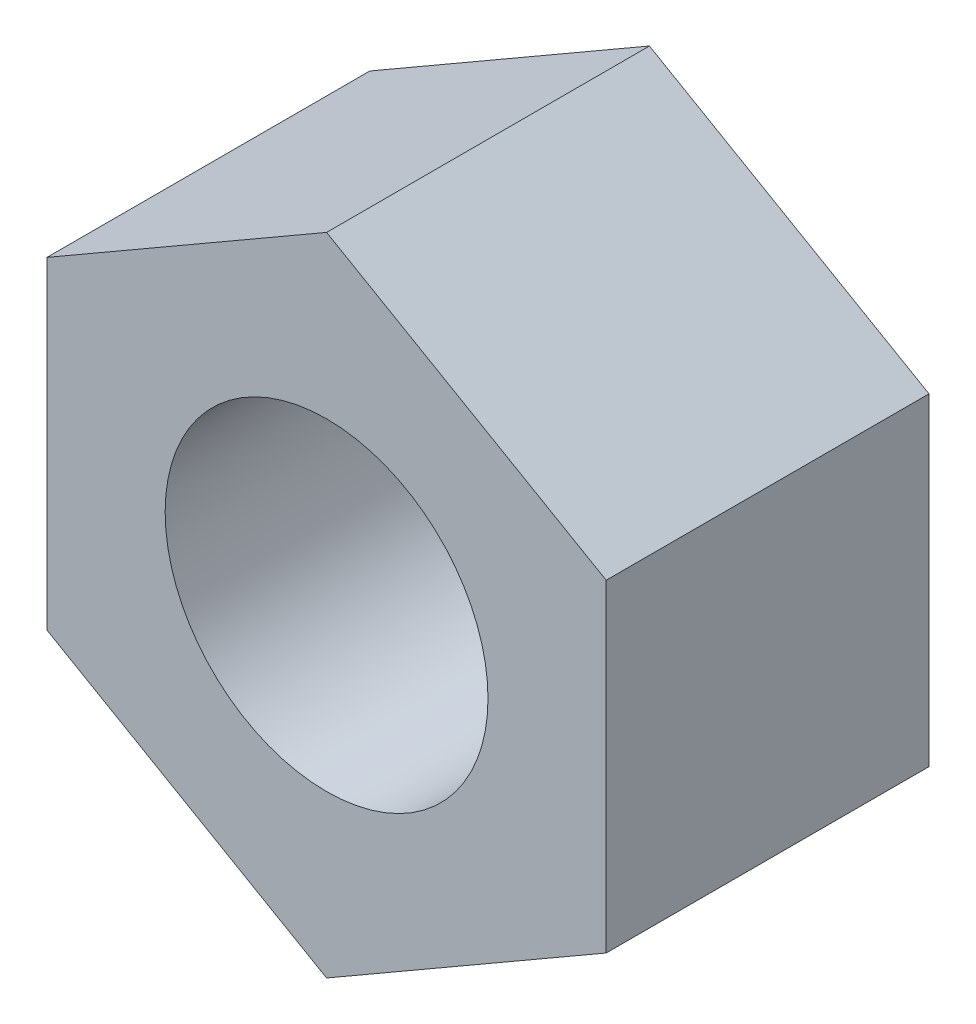
ISO-10303-21;
HEADER;
FILE_DESCRIPTION(('STEP AP214'),'2;1');
FILE_NAME('part.step','',(''),(''),'','','');
FILE_SCHEMA(('AUTOMOTIVE_DESIGN { 1 0 10303 214 1 1 1 1 }'));
ENDSEC;
DATA;
#1=APPLICATION_CONTEXT('core data for automotive mechanical design processes');
#2=APPLICATION_PROTOCOL_DEFINITION('international standard','automotive_design',2000,#1);
#3=PRODUCT_CONTEXT('',#1,'mechanical');
#4=PRODUCT('Part','Part','',(#3));
#5=PRODUCT_RELATED_PRODUCT_CATEGORY('part','',(#4));
#6=PRODUCT_DEFINITION_FORMATION('','',#4);
#7=PRODUCT_DEFINITION_CONTEXT('part definition',#1,'design');
#8=PRODUCT_DEFINITION('design','',#6,#7);
#9=PRODUCT_DEFINITION_SHAPE('','',#8);
#10=(LENGTH_UNIT() NAMED_UNIT(*) SI_UNIT(.MILLI.,.METRE.));
#11=(NAMED_UNIT(*) PLANE_ANGLE_UNIT() SI_UNIT($,.RADIAN.));
#12=(NAMED_UNIT(*) SI_UNIT($,.STERADIAN.) SOLID_ANGLE_UNIT());
#13=UNCERTAINTY_MEASURE_WITH_UNIT(LENGTH_MEASURE(1.E-05),#10,'distance_accuracy_value','');
#14=(GEOMETRIC_REPRESENTATION_CONTEXT(3) GLOBAL_UNCERTAINTY_ASSIGNED_CONTEXT((#13)) GLOBAL_UNIT_ASSIGNED_CONTEXT((#10,
#11,#12)) REPRESENTATION_CONTEXT('',''));
#15=CARTESIAN_POINT('',(0.,0.,0.));
#16=DIRECTION('',(0.,0.,1.));
#17=DIRECTION('',(1.,0.,0.));
#18=AXIS2_PLACEMENT_3D('',#15,#16,#17);
#19=CARTESIAN_POINT('',(1.73205080756888,1.,2.));
#20=DIRECTION('',(-0.5,-0.866025403784439,0.));
#21=DIRECTION('',(0.866025403784439,-0.5,0.));
#22=AXIS2_PLACEMENT_3D('',#19,#20,#21);
#23=PLANE('',#22);
#24=DIRECTION('',(-0.866025403784439,0.5,0.));
#25=VECTOR('',#24,1.);
#26=CARTESIAN_POINT('',(1.73205080756888,1.,0.));
#27=LINE('',#26,#25);
#28=CARTESIAN_POINT('',(1.73205080756888,1.,0.));
#29=VERTEX_POINT('',#28);
#30=CARTESIAN_POINT('',(0.,2.,0.));
#31=VERTEX_POINT('',#30);
#32=EDGE_CURVE('E119',#29,#31,#27,.T.);
#33=ORIENTED_EDGE('',*,*,#32,.T.);
#34=DIRECTION('',(0.,0.,-1.));
#35=VECTOR('',#34,1.);
#36=CARTESIAN_POINT('',(0.,2.,2.));
#37=LINE('',#36,#35);
#38=CARTESIAN_POINT('',(0.,2.,2.));
#39=VERTEX_POINT('',#38);
#40=EDGE_CURVE('E11',#39,#31,#37,.T.);
#41=ORIENTED_EDGE('',*,*,#40,.F.);
#42=DIRECTION('',(-0.866025403784439,0.5,0.));
#43=VECTOR('',#42,1.);
#44=CARTESIAN_POINT('',(1.73205080756888,1.,2.));
#45=LINE('',#44,#43);
#46=CARTESIAN_POINT('',(1.73205080756888,1.,2.));
#47=VERTEX_POINT('',#46);
#48=EDGE_CURVE('E130',#47,#39,#45,.T.);
#49=ORIENTED_EDGE('',*,*,#48,.F.);
#50=DIRECTION('',(0.,0.,-1.));
#51=VECTOR('',#50,1.);
#52=CARTESIAN_POINT('',(1.73205080756888,1.,2.));
#53=LINE('',#52,#51);
#54=EDGE_CURVE('E115',#47,#29,#53,.T.);
#55=ORIENTED_EDGE('',*,*,#54,.T.);
#56=EDGE_LOOP('',(#33,#41,#49,#55));
#57=FACE_BOUND('',#56,.T.);
#58=ADVANCED_FACE('F35',(#57),#23,.F.);
#59=CARTESIAN_POINT('',(0.,2.,2.));
#60=DIRECTION('',(0.5,-0.866025403784439,0.));
#61=DIRECTION('',(0.866025403784438,0.5,0.));
#62=AXIS2_PLACEMENT_3D('',#59,#60,#61);
#63=PLANE('',#62);
#64=DIRECTION('',(-0.866025403784438,-0.5,0.));
#65=VECTOR('',#64,1.);
#66=CARTESIAN_POINT('',(0.,2.,0.));
#67=LINE('',#66,#65);
#68=CARTESIAN_POINT('',(-1.73205080756888,1.,0.));
#69=VERTEX_POINT('',#68);
#70=EDGE_CURVE('E122',#31,#69,#67,.T.);
#71=ORIENTED_EDGE('',*,*,#70,.T.);
#72=DIRECTION('',(0.,0.,-1.));
#73=VECTOR('',#72,1.);
#74=CARTESIAN_POINT('',(-1.73205080756888,1.,2.));
#75=LINE('',#74,#73);
#76=CARTESIAN_POINT('',(-1.73205080756888,1.,2.));
#77=VERTEX_POINT('',#76);
#78=EDGE_CURVE('E43',#77,#69,#75,.T.);
#79=ORIENTED_EDGE('',*,*,#78,.F.);
#80=DIRECTION('',(-0.866025403784438,-0.5,0.));
#81=VECTOR('',#80,1.);
#82=CARTESIAN_POINT('',(0.,2.,2.));
#83=LINE('',#82,#81);
#84=EDGE_CURVE('E88',#39,#77,#83,.T.);
#85=ORIENTED_EDGE('',*,*,#84,.F.);
#86=ORIENTED_EDGE('',*,*,#40,.T.);
#87=EDGE_LOOP('',(#71,#79,#85,#86));
#88=FACE_BOUND('',#87,.T.);
#89=ADVANCED_FACE('F155',(#88),#63,.F.);
#90=CARTESIAN_POINT('',(-1.73205080756888,1.,2.));
#91=DIRECTION('',(1.,0.,0.));
#92=DIRECTION('',(0.,1.,0.));
#93=AXIS2_PLACEMENT_3D('',#90,#91,#92);
#94=PLANE('',#93);
#95=DIRECTION('',(0.,-1.,0.));
#96=VECTOR('',#95,1.);
#97=CARTESIAN_POINT('',(-1.73205080756888,1.,0.));
#98=LINE('',#97,#96);
#99=CARTESIAN_POINT('',(-1.73205080756888,-1.,0.));
#100=VERTEX_POINT('',#99);
#101=EDGE_CURVE('E125',#69,#100,#98,.T.);
#102=ORIENTED_EDGE('',*,*,#101,.T.);
#103=DIRECTION('',(0.,0.,-1.));
#104=VECTOR('',#103,1.);
#105=CARTESIAN_POINT('',(-1.73205080756888,-1.,2.));
#106=LINE('',#105,#104);
#107=CARTESIAN_POINT('',(-1.73205080756888,-1.,2.));
#108=VERTEX_POINT('',#107);
#109=EDGE_CURVE('E110',#108,#100,#106,.T.);
#110=ORIENTED_EDGE('',*,*,#109,.F.);
#111=DIRECTION('',(0.,-1.,0.));
#112=VECTOR('',#111,1.);
#113=CARTESIAN_POINT('',(-1.73205080756888,1.,2.));
#114=LINE('',#113,#112);
#115=EDGE_CURVE('E101',#77,#108,#114,.T.);
#116=ORIENTED_EDGE('',*,*,#115,.F.);
#117=ORIENTED_EDGE('',*,*,#78,.T.);
#118=EDGE_LOOP('',(#102,#110,#116,#117));
#119=FACE_BOUND('',#118,.T.);
#120=ADVANCED_FACE('F136',(#119),#94,.F.);
#121=CARTESIAN_POINT('',(-1.73205080756888,-1.,2.));
#122=DIRECTION('',(0.5,0.866025403784439,0.));
#123=DIRECTION('',(-0.866025403784439,0.5,0.));
#124=AXIS2_PLACEMENT_3D('',#121,#122,#123);
#125=PLANE('',#124);
#126=DIRECTION('',(0.866025403784439,-0.5,0.));
#127=VECTOR('',#126,1.);
#128=CARTESIAN_POINT('',(-1.73205080756888,-1.,0.));
#129=LINE('',#128,#127);
#130=CARTESIAN_POINT('',(0.,-2.,0.));
#131=VERTEX_POINT('',#130);
#132=EDGE_CURVE('E109',#100,#131,#129,.T.);
#133=ORIENTED_EDGE('',*,*,#132,.T.);
#134=DIRECTION('',(0.,0.,-1.));
#135=VECTOR('',#134,1.);
#136=CARTESIAN_POINT('',(0.,-2.,2.));
#137=LINE('',#136,#135);
#138=CARTESIAN_POINT('',(0.,-2.,2.));
#139=VERTEX_POINT('',#138);
#140=EDGE_CURVE('E106',#139,#131,#137,.T.);
#141=ORIENTED_EDGE('',*,*,#140,.F.);
#142=DIRECTION('',(0.866025403784439,-0.5,0.));
#143=VECTOR('',#142,1.);
#144=CARTESIAN_POINT('',(-1.73205080756888,-1.,2.));
#145=LINE('',#144,#143);
#146=EDGE_CURVE('E95',#108,#139,#145,.T.);
#147=ORIENTED_EDGE('',*,*,#146,.F.);
#148=ORIENTED_EDGE('',*,*,#109,.T.);
#149=EDGE_LOOP('',(#133,#141,#147,#148));
#150=FACE_BOUND('',#149,.T.);
#151=ADVANCED_FACE('F107',(#150),#125,.F.);
#152=CARTESIAN_POINT('',(0.,-2.,2.));
#153=DIRECTION('',(-0.5,0.866025403784439,0.));
#154=DIRECTION('',(-0.866025403784438,-0.5,0.));
#155=AXIS2_PLACEMENT_3D('',#152,#153,#154);
#156=PLANE('',#155);
#157=DIRECTION('',(0.866025403784438,0.5,0.));
#158=VECTOR('',#157,1.);
#159=CARTESIAN_POINT('',(0.,-2.,0.));
#160=LINE('',#159,#158);
#161=CARTESIAN_POINT('',(1.73205080756888,-1.,0.));
#162=VERTEX_POINT('',#161);
#163=EDGE_CURVE('E74',#131,#162,#160,.T.);
#164=ORIENTED_EDGE('',*,*,#163,.T.);
#165=DIRECTION('',(0.,0.,-1.));
#166=VECTOR('',#165,1.);
#167=CARTESIAN_POINT('',(1.73205080756888,-1.,2.));
#168=LINE('',#167,#166);
#169=CARTESIAN_POINT('',(1.73205080756888,-1.,2.));
#170=VERTEX_POINT('',#169);
#171=EDGE_CURVE('E111',#170,#162,#168,.T.);
#172=ORIENTED_EDGE('',*,*,#171,.F.);
#173=DIRECTION('',(0.866025403784438,0.5,0.));
#174=VECTOR('',#173,1.);
#175=CARTESIAN_POINT('',(0.,-2.,2.));
#176=LINE('',#175,#174);
#177=EDGE_CURVE('E99',#139,#170,#176,.T.);
#178=ORIENTED_EDGE('',*,*,#177,.F.);
#179=ORIENTED_EDGE('',*,*,#140,.T.);
#180=EDGE_LOOP('',(#164,#172,#178,#179));
#181=FACE_BOUND('',#180,.T.);
#182=ADVANCED_FACE('F113',(#181),#156,.F.);
#183=CARTESIAN_POINT('',(1.73205080756888,-1.,2.));
#184=DIRECTION('',(-1.,0.,0.));
#185=DIRECTION('',(0.,-1.,0.));
#186=AXIS2_PLACEMENT_3D('',#183,#184,#185);
#187=PLANE('',#186);
#188=DIRECTION('',(0.,1.,0.));
#189=VECTOR('',#188,1.);
#190=CARTESIAN_POINT('',(1.73205080756888,-1.,0.));
#191=LINE('',#190,#189);
#192=EDGE_CURVE('E80',#162,#29,#191,.T.);
#193=ORIENTED_EDGE('',*,*,#192,.T.);
#194=ORIENTED_EDGE('',*,*,#54,.F.);
#195=DIRECTION('',(0.,1.,0.));
#196=VECTOR('',#195,1.);
#197=CARTESIAN_POINT('',(1.73205080756888,-1.,2.));
#198=LINE('',#197,#196);
#199=EDGE_CURVE('E51',#170,#47,#198,.T.);
#200=ORIENTED_EDGE('',*,*,#199,.F.);
#201=ORIENTED_EDGE('',*,*,#171,.T.);
#202=EDGE_LOOP('',(#193,#194,#200,#201));
#203=FACE_BOUND('',#202,.T.);
#204=ADVANCED_FACE('F143',(#203),#187,.F.);
#205=CARTESIAN_POINT('',(0.,0.,2.));
#206=DIRECTION('',(0.,0.,1.));
#207=DIRECTION('',(1.,0.,0.));
#208=AXIS2_PLACEMENT_3D('',#205,#206,#207);
#209=PLANE('',#208);
#210=CARTESIAN_POINT('',(0.,0.,2.));
#211=DIRECTION('',(0.,0.,1.));
#212=DIRECTION('',(1.,0.,0.));
#213=AXIS2_PLACEMENT_3D('',#210,#211,#212);
#214=CIRCLE('',#213,1.);
#215=CARTESIAN_POINT('',(1.,0.,2.));
#216=VERTEX_POINT('',#215);
#217=EDGE_CURVE('E123',#216,#216,#214,.T.);
#218=ORIENTED_EDGE('',*,*,#217,.F.);
#219=EDGE_LOOP('',(#218));
#220=FACE_BOUND('',#219,.T.);
#221=ORIENTED_EDGE('',*,*,#48,.T.);
#222=ORIENTED_EDGE('',*,*,#84,.T.);
#223=ORIENTED_EDGE('',*,*,#115,.T.);
#224=ORIENTED_EDGE('',*,*,#146,.T.);
#225=ORIENTED_EDGE('',*,*,#177,.T.);
#226=ORIENTED_EDGE('',*,*,#199,.T.);
#227=EDGE_LOOP('',(#221,#222,#223,#224,#225,#226));
#228=FACE_BOUND('',#227,.T.);
#229=ADVANCED_FACE('F97',(#220,#228),#209,.T.);
#230=CARTESIAN_POINT('',(0.,0.,0.));
#231=DIRECTION('',(0.,0.,1.));
#232=DIRECTION('',(1.,0.,0.));
#233=AXIS2_PLACEMENT_3D('',#230,#231,#232);
#234=PLANE('',#233);
#235=CARTESIAN_POINT('',(0.,0.,0.));
#236=DIRECTION('',(0.,0.,-1.));
#237=DIRECTION('',(-1.,0.,0.));
#238=AXIS2_PLACEMENT_3D('',#235,#236,#237);
#239=CIRCLE('',#238,1.);
#240=CARTESIAN_POINT('',(-1.,0.,0.));
#241=VERTEX_POINT('',#240);
#242=EDGE_CURVE('E210',#241,#241,#239,.T.);
#243=ORIENTED_EDGE('',*,*,#242,.F.);
#244=EDGE_LOOP('',(#243));
#245=FACE_BOUND('',#244,.T.);
#246=ORIENTED_EDGE('',*,*,#32,.F.);
#247=ORIENTED_EDGE('',*,*,#192,.F.);
#248=ORIENTED_EDGE('',*,*,#163,.F.);
#249=ORIENTED_EDGE('',*,*,#132,.F.);
#250=ORIENTED_EDGE('',*,*,#101,.F.);
#251=ORIENTED_EDGE('',*,*,#70,.F.);
#252=EDGE_LOOP('',(#246,#247,#248,#249,#250,#251));
#253=FACE_BOUND('',#252,.T.);
#254=ADVANCED_FACE('F139',(#245,#253),#234,.F.);
#255=CARTESIAN_POINT('',(0.,0.,3.));
#256=DIRECTION('',(0.,0.,-1.));
#257=DIRECTION('',(-1.,0.,0.));
#258=AXIS2_PLACEMENT_3D('',#255,#256,#257);
#259=CYLINDRICAL_SURFACE('',#258,1.);
#260=ORIENTED_EDGE('',*,*,#217,.T.);
#261=EDGE_LOOP('',(#260));
#262=FACE_BOUND('',#261,.T.);
#263=ORIENTED_EDGE('',*,*,#242,.T.);
#264=EDGE_LOOP('',(#263));
#265=FACE_BOUND('',#264,.T.);
#266=ADVANCED_FACE('F192',(#262,#265),#259,.F.);
#267=CLOSED_SHELL('',(#58,#89,#120,#151,#182,#204,#229,#254,#266));
#268=MANIFOLD_SOLID_BREP('B2',#267);
#269=ADVANCED_BREP_SHAPE_REPRESENTATION('',(#18,#268),#14);
#270=SHAPE_DEFINITION_REPRESENTATION(#9,#269);
ENDSEC;
END-ISO-10303-21;
